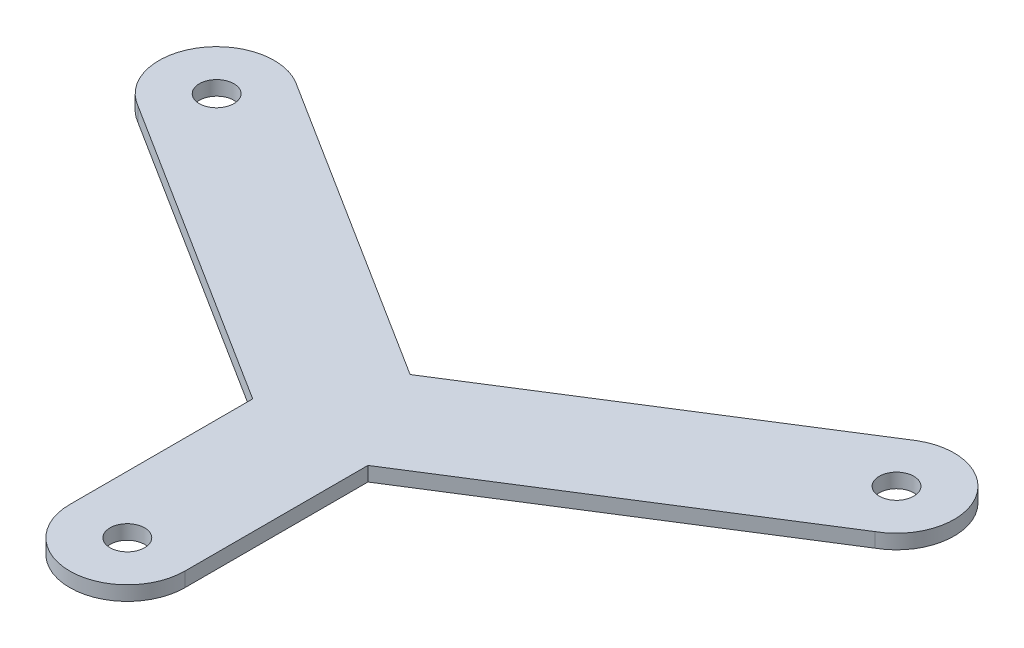
ISO-10303-21;
HEADER;
FILE_DESCRIPTION(('STEP AP214'),'2;1');
FILE_NAME('part.step','',(''),(''),'','','');
FILE_SCHEMA(('AUTOMOTIVE_DESIGN { 1 0 10303 214 1 1 1 1 }'));
ENDSEC;
DATA;
#1=APPLICATION_CONTEXT('core data for automotive mechanical design processes');
#2=APPLICATION_PROTOCOL_DEFINITION('international standard','automotive_design',2000,#1);
#3=PRODUCT_CONTEXT('',#1,'mechanical');
#4=PRODUCT('Part','Part','',(#3));
#5=PRODUCT_RELATED_PRODUCT_CATEGORY('part','',(#4));
#6=PRODUCT_DEFINITION_FORMATION('','',#4);
#7=PRODUCT_DEFINITION_CONTEXT('part definition',#1,'design');
#8=PRODUCT_DEFINITION('design','',#6,#7);
#9=PRODUCT_DEFINITION_SHAPE('','',#8);
#10=(LENGTH_UNIT() NAMED_UNIT(*) SI_UNIT(.MILLI.,.METRE.));
#11=(NAMED_UNIT(*) PLANE_ANGLE_UNIT() SI_UNIT($,.RADIAN.));
#12=(NAMED_UNIT(*) SI_UNIT($,.STERADIAN.) SOLID_ANGLE_UNIT());
#13=UNCERTAINTY_MEASURE_WITH_UNIT(LENGTH_MEASURE(1.E-05),#10,'distance_accuracy_value','');
#14=(GEOMETRIC_REPRESENTATION_CONTEXT(3) GLOBAL_UNCERTAINTY_ASSIGNED_CONTEXT((#13)) GLOBAL_UNIT_ASSIGNED_CONTEXT((#10,
#11,#12)) REPRESENTATION_CONTEXT('',''));
#15=CARTESIAN_POINT('',(0.,0.,0.));
#16=DIRECTION('',(0.,0.,1.));
#17=DIRECTION('',(1.,0.,0.));
#18=AXIS2_PLACEMENT_3D('',#15,#16,#17);
#19=CARTESIAN_POINT('',(-118.,5.,-74.5));
#20=DIRECTION('',(0.,-1.,0.));
#21=DIRECTION('',(0.,0.,-1.));
#22=AXIS2_PLACEMENT_3D('',#19,#20,#21);
#23=CYLINDRICAL_SURFACE('',#22,20.);
#24=CARTESIAN_POINT('',(-118.,0.,-74.5));
#25=DIRECTION('',(0.,1.,0.));
#26=DIRECTION('',(0.,0.,1.));
#27=AXIS2_PLACEMENT_3D('',#24,#25,#26);
#28=CIRCLE('',#27,20.);
#29=CARTESIAN_POINT('',(-107.892566895778,0.,-91.7580356948197));
#30=VERTEX_POINT('',#29);
#31=CARTESIAN_POINT('',(-127.892548484097,0.,-57.1178975814263));
#32=VERTEX_POINT('',#31);
#33=EDGE_CURVE('E133',#30,#32,#28,.T.);
#34=ORIENTED_EDGE('',*,*,#33,.T.);
#35=DIRECTION('',(0.,-1.,0.));
#36=VECTOR('',#35,1.);
#37=CARTESIAN_POINT('',(-127.892548484097,5.,-57.1178975814263));
#38=LINE('',#37,#36);
#39=CARTESIAN_POINT('',(-127.892548484097,5.,-57.1178975814263));
#40=VERTEX_POINT('',#39);
#41=EDGE_CURVE('E11',#40,#32,#38,.T.);
#42=ORIENTED_EDGE('',*,*,#41,.F.);
#43=CARTESIAN_POINT('',(-118.,5.,-74.5));
#44=DIRECTION('',(0.,1.,0.));
#45=DIRECTION('',(0.,0.,1.));
#46=AXIS2_PLACEMENT_3D('',#43,#44,#45);
#47=CIRCLE('',#46,20.);
#48=CARTESIAN_POINT('',(-107.892566895778,5.,-91.7580356948197));
#49=VERTEX_POINT('',#48);
#50=EDGE_CURVE('E150',#49,#40,#47,.T.);
#51=ORIENTED_EDGE('',*,*,#50,.F.);
#52=DIRECTION('',(0.,-1.,0.));
#53=VECTOR('',#52,1.);
#54=CARTESIAN_POINT('',(-107.892566895778,5.,-91.7580356948197));
#55=LINE('',#54,#53);
#56=EDGE_CURVE('E129',#49,#30,#55,.T.);
#57=ORIENTED_EDGE('',*,*,#56,.T.);
#58=EDGE_LOOP('',(#34,#42,#51,#57));
#59=FACE_BOUND('',#58,.T.);
#60=ADVANCED_FACE('F31',(#59),#23,.T.);
#61=CARTESIAN_POINT('',(-127.892548484097,5.,-57.1178975814263));
#62=DIRECTION('',(0.533784497009575,0.,-0.845620547735351));
#63=DIRECTION('',(-0.845620547735351,0.,-0.533784497009575));
#64=AXIS2_PLACEMENT_3D('',#61,#62,#63);
#65=PLANE('',#64);
#66=DIRECTION('',(0.845620547735351,0.,0.533784497009575));
#67=VECTOR('',#66,1.);
#68=CARTESIAN_POINT('',(-127.892548484097,0.,-57.1178975814263));
#69=LINE('',#68,#67);
#70=CARTESIAN_POINT('',(-19.9999815883196,0.,10.9875661585094));
#71=VERTEX_POINT('',#70);
#72=EDGE_CURVE('E136',#32,#71,#69,.T.);
#73=ORIENTED_EDGE('',*,*,#72,.T.);
#74=DIRECTION('',(0.,-1.,0.));
#75=VECTOR('',#74,1.);
#76=CARTESIAN_POINT('',(-19.9999815883196,5.,10.9875661585094));
#77=LINE('',#76,#75);
#78=CARTESIAN_POINT('',(-19.9999815883196,5.,10.9875661585094));
#79=VERTEX_POINT('',#78);
#80=EDGE_CURVE('E39',#79,#71,#77,.T.);
#81=ORIENTED_EDGE('',*,*,#80,.F.);
#82=DIRECTION('',(0.845620547735351,0.,0.533784497009575));
#83=VECTOR('',#82,1.);
#84=CARTESIAN_POINT('',(-127.892548484097,5.,-57.1178975814263));
#85=LINE('',#84,#83);
#86=EDGE_CURVE('E93',#40,#79,#85,.T.);
#87=ORIENTED_EDGE('',*,*,#86,.F.);
#88=ORIENTED_EDGE('',*,*,#41,.T.);
#89=EDGE_LOOP('',(#73,#81,#87,#88));
#90=FACE_BOUND('',#89,.T.);
#91=ADVANCED_FACE('F236',(#90),#65,.F.);
#92=CARTESIAN_POINT('',(-19.9999815883196,5.,10.9875661585094));
#93=DIRECTION('',(1.,0.,0.));
#94=DIRECTION('',(0.,0.,-1.));
#95=AXIS2_PLACEMENT_3D('',#92,#93,#94);
#96=PLANE('',#95);
#97=DIRECTION('',(0.,0.,1.));
#98=VECTOR('',#97,1.);
#99=CARTESIAN_POINT('',(-19.9999815883196,0.,10.9875661585094));
#100=LINE('',#99,#98);
#101=CARTESIAN_POINT('',(-19.9999815883196,0.,74.4728620767684));
#102=VERTEX_POINT('',#101);
#103=EDGE_CURVE('E139',#71,#102,#100,.T.);
#104=ORIENTED_EDGE('',*,*,#103,.T.);
#105=DIRECTION('',(0.,-1.,0.));
#106=VECTOR('',#105,1.);
#107=CARTESIAN_POINT('',(-19.9999815883196,5.,74.4728620767684));
#108=LINE('',#107,#106);
#109=CARTESIAN_POINT('',(-19.9999815883196,5.,74.4728620767684));
#110=VERTEX_POINT('',#109);
#111=EDGE_CURVE('E160',#110,#102,#108,.T.);
#112=ORIENTED_EDGE('',*,*,#111,.F.);
#113=DIRECTION('',(0.,0.,1.));
#114=VECTOR('',#113,1.);
#115=CARTESIAN_POINT('',(-19.9999815883196,5.,10.9875661585094));
#116=LINE('',#115,#114);
#117=EDGE_CURVE('E168',#79,#110,#116,.T.);
#118=ORIENTED_EDGE('',*,*,#117,.F.);
#119=ORIENTED_EDGE('',*,*,#80,.T.);
#120=EDGE_LOOP('',(#104,#112,#118,#119));
#121=FACE_BOUND('',#120,.T.);
#122=ADVANCED_FACE('F166',(#121),#96,.F.);
#123=CARTESIAN_POINT('',(0.,5.,74.5));
#124=DIRECTION('',(0.,-1.,0.));
#125=DIRECTION('',(0.,0.,-1.));
#126=AXIS2_PLACEMENT_3D('',#123,#124,#125);
#127=CYLINDRICAL_SURFACE('',#126,20.);
#128=CARTESIAN_POINT('',(0.,0.,74.5));
#129=DIRECTION('',(0.,1.,0.));
#130=DIRECTION('',(0.,0.,1.));
#131=AXIS2_PLACEMENT_3D('',#128,#129,#130);
#132=CIRCLE('',#131,20.);
#133=CARTESIAN_POINT('',(19.9999815883196,0.,74.4728620767684));
#134=VERTEX_POINT('',#133);
#135=EDGE_CURVE('E141',#102,#134,#132,.T.);
#136=ORIENTED_EDGE('',*,*,#135,.T.);
#137=DIRECTION('',(0.,-1.,0.));
#138=VECTOR('',#137,1.);
#139=CARTESIAN_POINT('',(19.9999815883196,5.,74.4728620767684));
#140=LINE('',#139,#138);
#141=CARTESIAN_POINT('',(19.9999815883196,5.,74.4728620767684));
#142=VERTEX_POINT('',#141);
#143=EDGE_CURVE('E157',#142,#134,#140,.T.);
#144=ORIENTED_EDGE('',*,*,#143,.F.);
#145=CARTESIAN_POINT('',(0.,5.,74.5));
#146=DIRECTION('',(0.,1.,0.));
#147=DIRECTION('',(0.,0.,1.));
#148=AXIS2_PLACEMENT_3D('',#145,#146,#147);
#149=CIRCLE('',#148,20.);
#150=EDGE_CURVE('E184',#110,#142,#149,.T.);
#151=ORIENTED_EDGE('',*,*,#150,.F.);
#152=ORIENTED_EDGE('',*,*,#111,.T.);
#153=EDGE_LOOP('',(#136,#144,#151,#152));
#154=FACE_BOUND('',#153,.T.);
#155=ADVANCED_FACE('F177',(#154),#127,.T.);
#156=CARTESIAN_POINT('',(19.9999815883196,5.,10.9875661585094));
#157=DIRECTION('',(-1.,0.,0.));
#158=DIRECTION('',(0.,0.,1.));
#159=AXIS2_PLACEMENT_3D('',#156,#157,#158);
#160=PLANE('',#159);
#161=DIRECTION('',(0.,0.,-1.));
#162=VECTOR('',#161,1.);
#163=CARTESIAN_POINT('',(19.9999815883196,0.,10.9875661585094));
#164=LINE('',#163,#162);
#165=CARTESIAN_POINT('',(19.9999815883196,0.,10.9875661585094));
#166=VERTEX_POINT('',#165);
#167=EDGE_CURVE('E143',#134,#166,#164,.T.);
#168=ORIENTED_EDGE('',*,*,#167,.T.);
#169=DIRECTION('',(0.,-1.,0.));
#170=VECTOR('',#169,1.);
#171=CARTESIAN_POINT('',(19.9999815883196,5.,10.9875661585094));
#172=LINE('',#171,#170);
#173=CARTESIAN_POINT('',(19.9999815883196,5.,10.9875661585094));
#174=VERTEX_POINT('',#173);
#175=EDGE_CURVE('E154',#174,#166,#172,.T.);
#176=ORIENTED_EDGE('',*,*,#175,.F.);
#177=DIRECTION('',(0.,0.,-1.));
#178=VECTOR('',#177,1.);
#179=CARTESIAN_POINT('',(19.9999815883196,5.,10.9875661585094));
#180=LINE('',#179,#178);
#181=EDGE_CURVE('E183',#142,#174,#180,.T.);
#182=ORIENTED_EDGE('',*,*,#181,.F.);
#183=ORIENTED_EDGE('',*,*,#143,.T.);
#184=EDGE_LOOP('',(#168,#176,#182,#183));
#185=FACE_BOUND('',#184,.T.);
#186=ADVANCED_FACE('F181',(#185),#160,.F.);
#187=CARTESIAN_POINT('',(127.892548484098,5.,-57.1178975814265));
#188=DIRECTION('',(-0.533784497009574,0.,-0.845620547735351));
#189=DIRECTION('',(-0.845620547735351,0.,0.533784497009574));
#190=AXIS2_PLACEMENT_3D('',#187,#188,#189);
#191=PLANE('',#190);
#192=DIRECTION('',(0.845620547735351,0.,-0.533784497009574));
#193=VECTOR('',#192,1.);
#194=CARTESIAN_POINT('',(127.892548484098,0.,-57.1178975814265));
#195=LINE('',#194,#193);
#196=CARTESIAN_POINT('',(127.892548484098,0.,-57.1178975814265));
#197=VERTEX_POINT('',#196);
#198=EDGE_CURVE('E145',#166,#197,#195,.T.);
#199=ORIENTED_EDGE('',*,*,#198,.T.);
#200=DIRECTION('',(0.,-1.,0.));
#201=VECTOR('',#200,1.);
#202=CARTESIAN_POINT('',(127.892548484098,5.,-57.1178975814265));
#203=LINE('',#202,#201);
#204=CARTESIAN_POINT('',(127.892548484098,5.,-57.1178975814265));
#205=VERTEX_POINT('',#204);
#206=EDGE_CURVE('E124',#205,#197,#203,.T.);
#207=ORIENTED_EDGE('',*,*,#206,.F.);
#208=DIRECTION('',(0.845620547735351,0.,-0.533784497009574));
#209=VECTOR('',#208,1.);
#210=CARTESIAN_POINT('',(127.892548484098,5.,-57.1178975814265));
#211=LINE('',#210,#209);
#212=EDGE_CURVE('E115',#174,#205,#211,.T.);
#213=ORIENTED_EDGE('',*,*,#212,.F.);
#214=ORIENTED_EDGE('',*,*,#175,.T.);
#215=EDGE_LOOP('',(#199,#207,#213,#214));
#216=FACE_BOUND('',#215,.T.);
#217=ADVANCED_FACE('F244',(#216),#191,.F.);
#218=CARTESIAN_POINT('',(118.,5.,-74.5));
#219=DIRECTION('',(0.,-1.,0.));
#220=DIRECTION('',(0.,0.,-1.));
#221=AXIS2_PLACEMENT_3D('',#218,#219,#220);
#222=CYLINDRICAL_SURFACE('',#221,20.);
#223=CARTESIAN_POINT('',(118.,0.,-74.5));
#224=DIRECTION('',(0.,1.,0.));
#225=DIRECTION('',(0.,0.,1.));
#226=AXIS2_PLACEMENT_3D('',#223,#224,#225);
#227=CIRCLE('',#226,20.);
#228=CARTESIAN_POINT('',(107.892566895778,0.,-91.7580356948199));
#229=VERTEX_POINT('',#228);
#230=EDGE_CURVE('E123',#197,#229,#227,.T.);
#231=ORIENTED_EDGE('',*,*,#230,.T.);
#232=DIRECTION('',(0.,-1.,0.));
#233=VECTOR('',#232,1.);
#234=CARTESIAN_POINT('',(107.892566895778,5.,-91.7580356948199));
#235=LINE('',#234,#233);
#236=CARTESIAN_POINT('',(107.892566895778,5.,-91.7580356948199));
#237=VERTEX_POINT('',#236);
#238=EDGE_CURVE('E120',#237,#229,#235,.T.);
#239=ORIENTED_EDGE('',*,*,#238,.F.);
#240=CARTESIAN_POINT('',(118.,5.,-74.5));
#241=DIRECTION('',(0.,1.,0.));
#242=DIRECTION('',(0.,0.,1.));
#243=AXIS2_PLACEMENT_3D('',#240,#241,#242);
#244=CIRCLE('',#243,20.);
#245=EDGE_CURVE('E109',#205,#237,#244,.T.);
#246=ORIENTED_EDGE('',*,*,#245,.F.);
#247=ORIENTED_EDGE('',*,*,#206,.T.);
#248=EDGE_LOOP('',(#231,#239,#246,#247));
#249=FACE_BOUND('',#248,.T.);
#250=ADVANCED_FACE('F121',(#249),#222,.T.);
#251=CARTESIAN_POINT('',(107.892566895778,5.,-91.7580356948199));
#252=DIRECTION('',(0.533784497009575,0.,0.845620547735351));
#253=DIRECTION('',(0.845620547735351,0.,-0.533784497009575));
#254=AXIS2_PLACEMENT_3D('',#251,#252,#253);
#255=PLANE('',#254);
#256=DIRECTION('',(-0.845620547735351,0.,0.533784497009575));
#257=VECTOR('',#256,1.);
#258=CARTESIAN_POINT('',(107.892566895778,0.,-91.7580356948199));
#259=LINE('',#258,#257);
#260=CARTESIAN_POINT('',(0.,0.,-23.6525719548839));
#261=VERTEX_POINT('',#260);
#262=EDGE_CURVE('E79',#229,#261,#259,.T.);
#263=ORIENTED_EDGE('',*,*,#262,.T.);
#264=DIRECTION('',(0.,-1.,0.));
#265=VECTOR('',#264,1.);
#266=CARTESIAN_POINT('',(0.,5.,-23.6525719548839));
#267=LINE('',#266,#265);
#268=CARTESIAN_POINT('',(0.,5.,-23.6525719548839));
#269=VERTEX_POINT('',#268);
#270=EDGE_CURVE('E125',#269,#261,#267,.T.);
#271=ORIENTED_EDGE('',*,*,#270,.F.);
#272=DIRECTION('',(-0.845620547735351,0.,0.533784497009575));
#273=VECTOR('',#272,1.);
#274=CARTESIAN_POINT('',(107.892566895778,5.,-91.7580356948199));
#275=LINE('',#274,#273);
#276=EDGE_CURVE('E113',#237,#269,#275,.T.);
#277=ORIENTED_EDGE('',*,*,#276,.F.);
#278=ORIENTED_EDGE('',*,*,#238,.T.);
#279=EDGE_LOOP('',(#263,#271,#277,#278));
#280=FACE_BOUND('',#279,.T.);
#281=ADVANCED_FACE('F127',(#280),#255,.F.);
#282=CARTESIAN_POINT('',(-107.892566895778,5.,-91.7580356948197));
#283=DIRECTION('',(-0.533784497009575,0.,0.845620547735351));
#284=DIRECTION('',(0.845620547735351,0.,0.533784497009575));
#285=AXIS2_PLACEMENT_3D('',#282,#283,#284);
#286=PLANE('',#285);
#287=DIRECTION('',(-0.845620547735351,0.,-0.533784497009575));
#288=VECTOR('',#287,1.);
#289=CARTESIAN_POINT('',(-107.892566895778,0.,-91.7580356948197));
#290=LINE('',#289,#288);
#291=EDGE_CURVE('E85',#261,#30,#290,.T.);
#292=ORIENTED_EDGE('',*,*,#291,.T.);
#293=ORIENTED_EDGE('',*,*,#56,.F.);
#294=DIRECTION('',(-0.845620547735351,0.,-0.533784497009575));
#295=VECTOR('',#294,1.);
#296=CARTESIAN_POINT('',(-107.892566895778,5.,-91.7580356948197));
#297=LINE('',#296,#295);
#298=EDGE_CURVE('E47',#269,#49,#297,.T.);
#299=ORIENTED_EDGE('',*,*,#298,.F.);
#300=ORIENTED_EDGE('',*,*,#270,.T.);
#301=EDGE_LOOP('',(#292,#293,#299,#300));
#302=FACE_BOUND('',#301,.T.);
#303=ADVANCED_FACE('F214',(#302),#286,.F.);
#304=CARTESIAN_POINT('',(-118.,5.,-74.5));
#305=DIRECTION('',(0.,1.,0.));
#306=DIRECTION('',(0.,0.,1.));
#307=AXIS2_PLACEMENT_3D('',#304,#305,#306);
#308=PLANE('',#307);
#309=CARTESIAN_POINT('',(0.,5.,74.5));
#310=DIRECTION('',(0.,1.,0.));
#311=DIRECTION('',(0.,0.,1.));
#312=AXIS2_PLACEMENT_3D('',#309,#310,#311);
#313=CIRCLE('',#312,6.);
#314=CARTESIAN_POINT('',(0.,5.,80.5));
#315=VERTEX_POINT('',#314);
#316=EDGE_CURVE('E205',#315,#315,#313,.T.);
#317=ORIENTED_EDGE('',*,*,#316,.F.);
#318=EDGE_LOOP('',(#317));
#319=FACE_BOUND('',#318,.T.);
#320=CARTESIAN_POINT('',(118.,5.,-74.5));
#321=DIRECTION('',(0.,1.,0.));
#322=DIRECTION('',(0.,0.,1.));
#323=AXIS2_PLACEMENT_3D('',#320,#321,#322);
#324=CIRCLE('',#323,6.);
#325=CARTESIAN_POINT('',(118.,5.,-68.5));
#326=VERTEX_POINT('',#325);
#327=EDGE_CURVE('E199',#326,#326,#324,.T.);
#328=ORIENTED_EDGE('',*,*,#327,.F.);
#329=EDGE_LOOP('',(#328));
#330=FACE_BOUND('',#329,.T.);
#331=CARTESIAN_POINT('',(-118.,5.,-74.5));
#332=DIRECTION('',(0.,1.,0.));
#333=DIRECTION('',(0.,0.,1.));
#334=AXIS2_PLACEMENT_3D('',#331,#332,#333);
#335=CIRCLE('',#334,6.);
#336=CARTESIAN_POINT('',(-118.,5.,-68.5));
#337=VERTEX_POINT('',#336);
#338=EDGE_CURVE('E193',#337,#337,#335,.T.);
#339=ORIENTED_EDGE('',*,*,#338,.F.);
#340=EDGE_LOOP('',(#339));
#341=FACE_BOUND('',#340,.T.);
#342=ORIENTED_EDGE('',*,*,#50,.T.);
#343=ORIENTED_EDGE('',*,*,#86,.T.);
#344=ORIENTED_EDGE('',*,*,#117,.T.);
#345=ORIENTED_EDGE('',*,*,#150,.T.);
#346=ORIENTED_EDGE('',*,*,#181,.T.);
#347=ORIENTED_EDGE('',*,*,#212,.T.);
#348=ORIENTED_EDGE('',*,*,#245,.T.);
#349=ORIENTED_EDGE('',*,*,#276,.T.);
#350=ORIENTED_EDGE('',*,*,#298,.T.);
#351=EDGE_LOOP('',(#342,#343,#344,#345,#346,#347,#348,#349,#350));
#352=FACE_BOUND('',#351,.T.);
#353=ADVANCED_FACE('F111',(#319,#330,#341,#352),#308,.T.);
#354=CARTESIAN_POINT('',(-118.,0.,-74.5));
#355=DIRECTION('',(0.,1.,0.));
#356=DIRECTION('',(0.,0.,1.));
#357=AXIS2_PLACEMENT_3D('',#354,#355,#356);
#358=PLANE('',#357);
#359=CARTESIAN_POINT('',(0.,0.,74.5));
#360=DIRECTION('',(0.,1.,0.));
#361=DIRECTION('',(0.,0.,1.));
#362=AXIS2_PLACEMENT_3D('',#359,#360,#361);
#363=CIRCLE('',#362,6.);
#364=CARTESIAN_POINT('',(0.,0.,80.5));
#365=VERTEX_POINT('',#364);
#366=EDGE_CURVE('E202',#365,#365,#363,.F.);
#367=ORIENTED_EDGE('',*,*,#366,.F.);
#368=EDGE_LOOP('',(#367));
#369=FACE_BOUND('',#368,.T.);
#370=CARTESIAN_POINT('',(118.,0.,-74.5));
#371=DIRECTION('',(0.,1.,0.));
#372=DIRECTION('',(0.,0.,1.));
#373=AXIS2_PLACEMENT_3D('',#370,#371,#372);
#374=CIRCLE('',#373,6.);
#375=CARTESIAN_POINT('',(118.,0.,-68.5));
#376=VERTEX_POINT('',#375);
#377=EDGE_CURVE('E196',#376,#376,#374,.F.);
#378=ORIENTED_EDGE('',*,*,#377,.F.);
#379=EDGE_LOOP('',(#378));
#380=FACE_BOUND('',#379,.T.);
#381=CARTESIAN_POINT('',(-118.,0.,-74.5));
#382=DIRECTION('',(0.,1.,0.));
#383=DIRECTION('',(0.,0.,1.));
#384=AXIS2_PLACEMENT_3D('',#381,#382,#383);
#385=CIRCLE('',#384,6.);
#386=CARTESIAN_POINT('',(-118.,0.,-68.5));
#387=VERTEX_POINT('',#386);
#388=EDGE_CURVE('E137',#387,#387,#385,.F.);
#389=ORIENTED_EDGE('',*,*,#388,.F.);
#390=EDGE_LOOP('',(#389));
#391=FACE_BOUND('',#390,.T.);
#392=ORIENTED_EDGE('',*,*,#33,.F.);
#393=ORIENTED_EDGE('',*,*,#291,.F.);
#394=ORIENTED_EDGE('',*,*,#262,.F.);
#395=ORIENTED_EDGE('',*,*,#230,.F.);
#396=ORIENTED_EDGE('',*,*,#198,.F.);
#397=ORIENTED_EDGE('',*,*,#167,.F.);
#398=ORIENTED_EDGE('',*,*,#135,.F.);
#399=ORIENTED_EDGE('',*,*,#103,.F.);
#400=ORIENTED_EDGE('',*,*,#72,.F.);
#401=EDGE_LOOP('',(#392,#393,#394,#395,#396,#397,#398,#399,#400));
#402=FACE_BOUND('',#401,.T.);
#403=ADVANCED_FACE('F172',(#369,#380,#391,#402),#358,.F.);
#404=CARTESIAN_POINT('',(-118.,-0.00100000000000013,-74.5));
#405=DIRECTION('',(0.,1.,0.));
#406=DIRECTION('',(0.,0.,1.));
#407=AXIS2_PLACEMENT_3D('',#404,#405,#406);
#408=CYLINDRICAL_SURFACE('',#407,6.);
#409=ORIENTED_EDGE('',*,*,#338,.T.);
#410=EDGE_LOOP('',(#409));
#411=FACE_BOUND('',#410,.T.);
#412=ORIENTED_EDGE('',*,*,#388,.T.);
#413=EDGE_LOOP('',(#412));
#414=FACE_BOUND('',#413,.T.);
#415=ADVANCED_FACE('F220',(#411,#414),#408,.F.);
#416=CARTESIAN_POINT('',(118.,-0.00100000000000013,-74.5));
#417=DIRECTION('',(0.,1.,0.));
#418=DIRECTION('',(0.,0.,1.));
#419=AXIS2_PLACEMENT_3D('',#416,#417,#418);
#420=CYLINDRICAL_SURFACE('',#419,6.);
#421=ORIENTED_EDGE('',*,*,#327,.T.);
#422=EDGE_LOOP('',(#421));
#423=FACE_BOUND('',#422,.T.);
#424=ORIENTED_EDGE('',*,*,#377,.T.);
#425=EDGE_LOOP('',(#424));
#426=FACE_BOUND('',#425,.T.);
#427=ADVANCED_FACE('F223',(#423,#426),#420,.F.);
#428=CARTESIAN_POINT('',(0.,-0.00100000000000013,74.5));
#429=DIRECTION('',(0.,1.,0.));
#430=DIRECTION('',(0.,0.,1.));
#431=AXIS2_PLACEMENT_3D('',#428,#429,#430);
#432=CYLINDRICAL_SURFACE('',#431,6.);
#433=ORIENTED_EDGE('',*,*,#316,.T.);
#434=EDGE_LOOP('',(#433));
#435=FACE_BOUND('',#434,.T.);
#436=ORIENTED_EDGE('',*,*,#366,.T.);
#437=EDGE_LOOP('',(#436));
#438=FACE_BOUND('',#437,.T.);
#439=ADVANCED_FACE('F209',(#435,#438),#432,.F.);
#440=CLOSED_SHELL('',(#60,#91,#122,#155,#186,#217,#250,#281,#303,#353,#403,#415,#427,#439));
#441=MANIFOLD_SOLID_BREP('B2',#440);
#442=ADVANCED_BREP_SHAPE_REPRESENTATION('',(#18,#441),#14);
#443=SHAPE_DEFINITION_REPRESENTATION(#9,#442);
ENDSEC;
END-ISO-10303-21;
